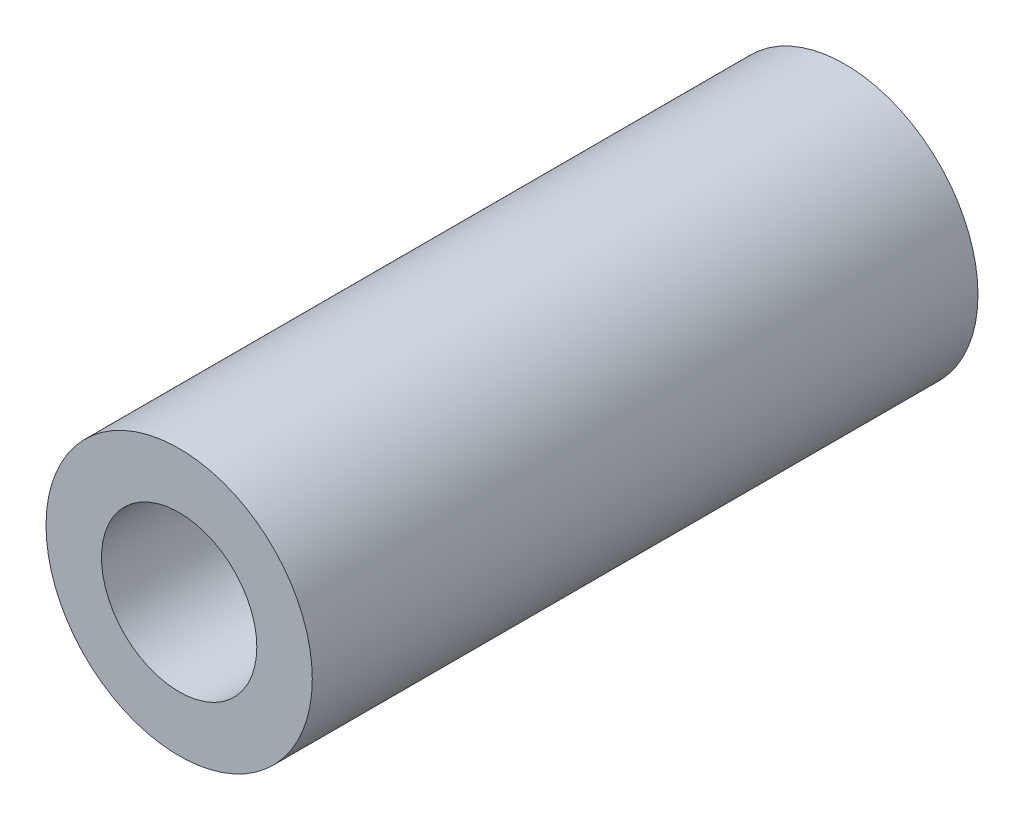
ISO-10303-21;
HEADER;
FILE_DESCRIPTION(('STEP AP214'),'2;1');
FILE_NAME('part.step','',(''),(''),'','','');
FILE_SCHEMA(('AUTOMOTIVE_DESIGN { 1 0 10303 214 1 1 1 1 }'));
ENDSEC;
DATA;
#1=APPLICATION_CONTEXT('core data for automotive mechanical design processes');
#2=APPLICATION_PROTOCOL_DEFINITION('international standard','automotive_design',2000,#1);
#3=PRODUCT_CONTEXT('',#1,'mechanical');
#4=PRODUCT('Part','Part','',(#3));
#5=PRODUCT_RELATED_PRODUCT_CATEGORY('part','',(#4));
#6=PRODUCT_DEFINITION_FORMATION('','',#4);
#7=PRODUCT_DEFINITION_CONTEXT('part definition',#1,'design');
#8=PRODUCT_DEFINITION('design','',#6,#7);
#9=PRODUCT_DEFINITION_SHAPE('','',#8);
#10=(LENGTH_UNIT() NAMED_UNIT(*) SI_UNIT(.MILLI.,.METRE.));
#11=(NAMED_UNIT(*) PLANE_ANGLE_UNIT() SI_UNIT($,.RADIAN.));
#12=(NAMED_UNIT(*) SI_UNIT($,.STERADIAN.) SOLID_ANGLE_UNIT());
#13=UNCERTAINTY_MEASURE_WITH_UNIT(LENGTH_MEASURE(1.E-05),#10,'distance_accuracy_value','');
#14=(GEOMETRIC_REPRESENTATION_CONTEXT(3) GLOBAL_UNCERTAINTY_ASSIGNED_CONTEXT((#13)) GLOBAL_UNIT_ASSIGNED_CONTEXT((#10,
#11,#12)) REPRESENTATION_CONTEXT('',''));
#15=CARTESIAN_POINT('',(0.,0.,0.));
#16=DIRECTION('',(0.,0.,1.));
#17=DIRECTION('',(1.,0.,0.));
#18=AXIS2_PLACEMENT_3D('',#15,#16,#17);
#19=CARTESIAN_POINT('',(2.30447602689268,0.806470296454291,10.));
#20=DIRECTION('',(0.,0.,1.));
#21=DIRECTION('',(1.,0.,0.));
#22=AXIS2_PLACEMENT_3D('',#19,#20,#21);
#23=PLANE('',#22);
#24=CARTESIAN_POINT('',(1.13780936022601,0.806470296454291,10.));
#25=DIRECTION('',(0.,0.,1.));
#26=DIRECTION('',(1.,0.,0.));
#27=AXIS2_PLACEMENT_3D('',#24,#25,#26);
#28=CIRCLE('',#27,2.);
#29=CARTESIAN_POINT('',(3.13780936022601,0.806470296454291,10.));
#30=VERTEX_POINT('',#29);
#31=EDGE_CURVE('E10',#30,#30,#28,.T.);
#32=ORIENTED_EDGE('',*,*,#31,.T.);
#33=EDGE_LOOP('',(#32));
#34=FACE_BOUND('',#33,.T.);
#35=CARTESIAN_POINT('',(1.13780936022601,0.806470296454291,10.));
#36=DIRECTION('',(0.,0.,1.));
#37=DIRECTION('',(1.,0.,0.));
#38=AXIS2_PLACEMENT_3D('',#35,#36,#37);
#39=CIRCLE('',#38,1.16666666666667);
#40=CARTESIAN_POINT('',(2.30447602689268,0.806470296454291,10.));
#41=VERTEX_POINT('',#40);
#42=EDGE_CURVE('E51',#41,#41,#39,.T.);
#43=ORIENTED_EDGE('',*,*,#42,.F.);
#44=EDGE_LOOP('',(#43));
#45=FACE_BOUND('',#44,.T.);
#46=ADVANCED_FACE('F37',(#34,#45),#23,.T.);
#47=CARTESIAN_POINT('',(1.13780936022601,0.806470296454291,0.));
#48=DIRECTION('',(0.,0.,1.));
#49=DIRECTION('',(1.,0.,0.));
#50=AXIS2_PLACEMENT_3D('',#47,#48,#49);
#51=CYLINDRICAL_SURFACE('',#50,2.);
#52=CARTESIAN_POINT('',(1.13780936022601,0.806470296454291,0.));
#53=DIRECTION('',(0.,0.,1.));
#54=DIRECTION('',(1.,0.,0.));
#55=AXIS2_PLACEMENT_3D('',#52,#53,#54);
#56=CIRCLE('',#55,2.);
#57=CARTESIAN_POINT('',(3.13780936022601,0.806470296454291,0.));
#58=VERTEX_POINT('',#57);
#59=EDGE_CURVE('E43',#58,#58,#56,.T.);
#60=ORIENTED_EDGE('',*,*,#59,.T.);
#61=EDGE_LOOP('',(#60));
#62=FACE_BOUND('',#61,.T.);
#63=ORIENTED_EDGE('',*,*,#31,.F.);
#64=EDGE_LOOP('',(#63));
#65=FACE_BOUND('',#64,.T.);
#66=ADVANCED_FACE('F61',(#62,#65),#51,.T.);
#67=CARTESIAN_POINT('',(3.13780936022601,0.806470296454291,0.));
#68=DIRECTION('',(0.,0.,-1.));
#69=DIRECTION('',(-1.,0.,0.));
#70=AXIS2_PLACEMENT_3D('',#67,#68,#69);
#71=PLANE('',#70);
#72=CARTESIAN_POINT('',(1.13780936022601,0.806470296454291,0.));
#73=DIRECTION('',(0.,0.,1.));
#74=DIRECTION('',(1.,0.,0.));
#75=AXIS2_PLACEMENT_3D('',#72,#73,#74);
#76=CIRCLE('',#75,1.16666666666667);
#77=CARTESIAN_POINT('',(2.30447602689268,0.806470296454291,0.));
#78=VERTEX_POINT('',#77);
#79=EDGE_CURVE('E47',#78,#78,#76,.T.);
#80=ORIENTED_EDGE('',*,*,#79,.T.);
#81=EDGE_LOOP('',(#80));
#82=FACE_BOUND('',#81,.T.);
#83=ORIENTED_EDGE('',*,*,#59,.F.);
#84=EDGE_LOOP('',(#83));
#85=FACE_BOUND('',#84,.T.);
#86=ADVANCED_FACE('F65',(#82,#85),#71,.T.);
#87=CARTESIAN_POINT('',(1.13780936022601,0.806470296454291,0.));
#88=DIRECTION('',(0.,0.,1.));
#89=DIRECTION('',(1.,0.,0.));
#90=AXIS2_PLACEMENT_3D('',#87,#88,#89);
#91=CYLINDRICAL_SURFACE('',#90,1.16666666666667);
#92=ORIENTED_EDGE('',*,*,#42,.T.);
#93=EDGE_LOOP('',(#92));
#94=FACE_BOUND('',#93,.T.);
#95=ORIENTED_EDGE('',*,*,#79,.F.);
#96=EDGE_LOOP('',(#95));
#97=FACE_BOUND('',#96,.T.);
#98=ADVANCED_FACE('F57',(#94,#97),#91,.F.);
#99=CLOSED_SHELL('',(#46,#66,#86,#98));
#100=MANIFOLD_SOLID_BREP('B2',#99);
#101=ADVANCED_BREP_SHAPE_REPRESENTATION('',(#18,#100),#14);
#102=SHAPE_DEFINITION_REPRESENTATION(#9,#101);
ENDSEC;
END-ISO-10303-21;
